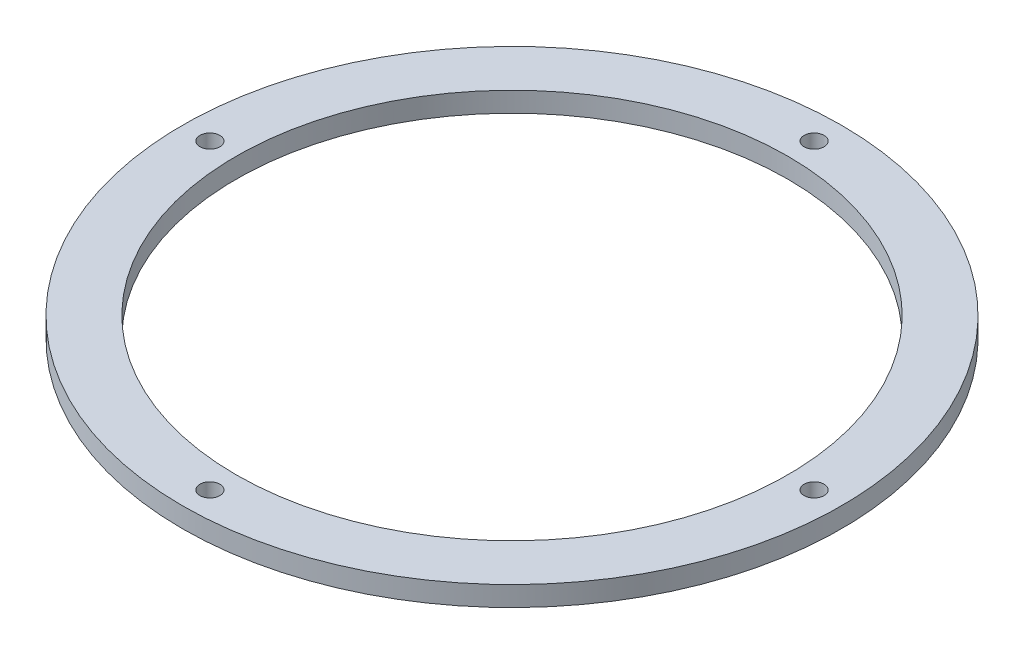
ISO-10303-21;
HEADER;
FILE_DESCRIPTION(('STEP AP214'),'2;1');
FILE_NAME('part.step','',(''),(''),'','','');
FILE_SCHEMA(('AUTOMOTIVE_DESIGN { 1 0 10303 214 1 1 1 1 }'));
ENDSEC;
DATA;
#1=APPLICATION_CONTEXT('core data for automotive mechanical design processes');
#2=APPLICATION_PROTOCOL_DEFINITION('international standard','automotive_design',2000,#1);
#3=PRODUCT_CONTEXT('',#1,'mechanical');
#4=PRODUCT('Part','Part','',(#3));
#5=PRODUCT_RELATED_PRODUCT_CATEGORY('part','',(#4));
#6=PRODUCT_DEFINITION_FORMATION('','',#4);
#7=PRODUCT_DEFINITION_CONTEXT('part definition',#1,'design');
#8=PRODUCT_DEFINITION('design','',#6,#7);
#9=PRODUCT_DEFINITION_SHAPE('','',#8);
#10=(LENGTH_UNIT() NAMED_UNIT(*) SI_UNIT(.MILLI.,.METRE.));
#11=(NAMED_UNIT(*) PLANE_ANGLE_UNIT() SI_UNIT($,.RADIAN.));
#12=(NAMED_UNIT(*) SI_UNIT($,.STERADIAN.) SOLID_ANGLE_UNIT());
#13=UNCERTAINTY_MEASURE_WITH_UNIT(LENGTH_MEASURE(1.E-05),#10,'distance_accuracy_value','');
#14=(GEOMETRIC_REPRESENTATION_CONTEXT(3) GLOBAL_UNCERTAINTY_ASSIGNED_CONTEXT((#13)) GLOBAL_UNIT_ASSIGNED_CONTEXT((#10,
#11,#12)) REPRESENTATION_CONTEXT('',''));
#15=CARTESIAN_POINT('',(0.,0.,0.));
#16=DIRECTION('',(0.,0.,1.));
#17=DIRECTION('',(1.,0.,0.));
#18=AXIS2_PLACEMENT_3D('',#15,#16,#17);
#19=CARTESIAN_POINT('',(0.,5.2,0.));
#20=DIRECTION('',(0.,1.,0.));
#21=DIRECTION('',(0.,0.,1.));
#22=AXIS2_PLACEMENT_3D('',#19,#20,#21);
#23=PLANE('',#22);
#24=CARTESIAN_POINT('',(0.,5.2,78.83));
#25=DIRECTION('',(0.,1.,0.));
#26=DIRECTION('',(0.,0.,1.));
#27=AXIS2_PLACEMENT_3D('',#24,#25,#26);
#28=CIRCLE('',#27,2.60000000000001);
#29=CARTESIAN_POINT('',(0.,5.2,81.43));
#30=VERTEX_POINT('',#29);
#31=EDGE_CURVE('E67',#30,#30,#28,.T.);
#32=ORIENTED_EDGE('',*,*,#31,.F.);
#33=EDGE_LOOP('',(#32));
#34=FACE_BOUND('',#33,.T.);
#35=CARTESIAN_POINT('',(0.,5.2,-78.83));
#36=DIRECTION('',(0.,1.,0.));
#37=DIRECTION('',(0.,0.,1.));
#38=AXIS2_PLACEMENT_3D('',#35,#36,#37);
#39=CIRCLE('',#38,2.60000000000001);
#40=CARTESIAN_POINT('',(0.,5.2,-76.23));
#41=VERTEX_POINT('',#40);
#42=EDGE_CURVE('E55',#41,#41,#39,.T.);
#43=ORIENTED_EDGE('',*,*,#42,.F.);
#44=EDGE_LOOP('',(#43));
#45=FACE_BOUND('',#44,.T.);
#46=CARTESIAN_POINT('',(0.,5.2,0.));
#47=DIRECTION('',(0.,1.,0.));
#48=DIRECTION('',(0.,0.,1.));
#49=AXIS2_PLACEMENT_3D('',#46,#47,#48);
#50=CIRCLE('',#49,86.);
#51=CARTESIAN_POINT('',(0.,5.2,86.));
#52=VERTEX_POINT('',#51);
#53=EDGE_CURVE('E10',#52,#52,#50,.T.);
#54=ORIENTED_EDGE('',*,*,#53,.T.);
#55=EDGE_LOOP('',(#54));
#56=FACE_BOUND('',#55,.T.);
#57=CARTESIAN_POINT('',(0.,5.2,0.));
#58=DIRECTION('',(0.,1.,0.));
#59=DIRECTION('',(0.,0.,1.));
#60=AXIS2_PLACEMENT_3D('',#57,#58,#59);
#61=CIRCLE('',#60,72.);
#62=CARTESIAN_POINT('',(0.,5.2,72.));
#63=VERTEX_POINT('',#62);
#64=EDGE_CURVE('E50',#63,#63,#61,.T.);
#65=ORIENTED_EDGE('',*,*,#64,.F.);
#66=EDGE_LOOP('',(#65));
#67=FACE_BOUND('',#66,.T.);
#68=CARTESIAN_POINT('',(78.83,5.2,0.));
#69=DIRECTION('',(0.,1.,0.));
#70=DIRECTION('',(0.,0.,1.));
#71=AXIS2_PLACEMENT_3D('',#68,#69,#70);
#72=CIRCLE('',#71,2.6);
#73=CARTESIAN_POINT('',(78.83,5.2,2.6));
#74=VERTEX_POINT('',#73);
#75=EDGE_CURVE('E61',#74,#74,#72,.T.);
#76=ORIENTED_EDGE('',*,*,#75,.F.);
#77=EDGE_LOOP('',(#76));
#78=FACE_BOUND('',#77,.T.);
#79=CARTESIAN_POINT('',(-78.83,5.2,0.));
#80=DIRECTION('',(0.,1.,0.));
#81=DIRECTION('',(0.,0.,1.));
#82=AXIS2_PLACEMENT_3D('',#79,#80,#81);
#83=CIRCLE('',#82,2.6);
#84=CARTESIAN_POINT('',(-78.83,5.2,2.6));
#85=VERTEX_POINT('',#84);
#86=EDGE_CURVE('E73',#85,#85,#83,.T.);
#87=ORIENTED_EDGE('',*,*,#86,.F.);
#88=EDGE_LOOP('',(#87));
#89=FACE_BOUND('',#88,.T.);
#90=ADVANCED_FACE('F39',(#34,#45,#56,#67,#78,#89),#23,.T.);
#91=CARTESIAN_POINT('',(0.,0.,0.));
#92=DIRECTION('',(0.,1.,0.));
#93=DIRECTION('',(0.,0.,1.));
#94=AXIS2_PLACEMENT_3D('',#91,#92,#93);
#95=PLANE('',#94);
#96=CARTESIAN_POINT('',(0.,0.,0.));
#97=DIRECTION('',(0.,1.,0.));
#98=DIRECTION('',(0.,0.,1.));
#99=AXIS2_PLACEMENT_3D('',#96,#97,#98);
#100=CIRCLE('',#99,86.);
#101=CARTESIAN_POINT('',(0.,0.,86.));
#102=VERTEX_POINT('',#101);
#103=EDGE_CURVE('E43',#102,#102,#100,.T.);
#104=ORIENTED_EDGE('',*,*,#103,.F.);
#105=EDGE_LOOP('',(#104));
#106=FACE_BOUND('',#105,.T.);
#107=CARTESIAN_POINT('',(0.,0.,0.));
#108=DIRECTION('',(0.,1.,0.));
#109=DIRECTION('',(0.,0.,1.));
#110=AXIS2_PLACEMENT_3D('',#107,#108,#109);
#111=CIRCLE('',#110,72.);
#112=CARTESIAN_POINT('',(0.,0.,72.));
#113=VERTEX_POINT('',#112);
#114=EDGE_CURVE('E52',#113,#113,#111,.T.);
#115=ORIENTED_EDGE('',*,*,#114,.T.);
#116=EDGE_LOOP('',(#115));
#117=FACE_BOUND('',#116,.T.);
#118=CARTESIAN_POINT('',(0.,0.,-78.83));
#119=DIRECTION('',(0.,1.,0.));
#120=DIRECTION('',(0.,0.,1.));
#121=AXIS2_PLACEMENT_3D('',#118,#119,#120);
#122=CIRCLE('',#121,2.60000000000001);
#123=CARTESIAN_POINT('',(0.,0.,-76.23));
#124=VERTEX_POINT('',#123);
#125=EDGE_CURVE('E58',#124,#124,#122,.T.);
#126=ORIENTED_EDGE('',*,*,#125,.T.);
#127=EDGE_LOOP('',(#126));
#128=FACE_BOUND('',#127,.T.);
#129=CARTESIAN_POINT('',(78.83,0.,0.));
#130=DIRECTION('',(0.,1.,0.));
#131=DIRECTION('',(0.,0.,1.));
#132=AXIS2_PLACEMENT_3D('',#129,#130,#131);
#133=CIRCLE('',#132,2.6);
#134=CARTESIAN_POINT('',(78.83,0.,2.6));
#135=VERTEX_POINT('',#134);
#136=EDGE_CURVE('E64',#135,#135,#133,.T.);
#137=ORIENTED_EDGE('',*,*,#136,.T.);
#138=EDGE_LOOP('',(#137));
#139=FACE_BOUND('',#138,.T.);
#140=CARTESIAN_POINT('',(0.,0.,78.83));
#141=DIRECTION('',(0.,1.,0.));
#142=DIRECTION('',(0.,0.,1.));
#143=AXIS2_PLACEMENT_3D('',#140,#141,#142);
#144=CIRCLE('',#143,2.60000000000001);
#145=CARTESIAN_POINT('',(0.,0.,81.43));
#146=VERTEX_POINT('',#145);
#147=EDGE_CURVE('E70',#146,#146,#144,.T.);
#148=ORIENTED_EDGE('',*,*,#147,.T.);
#149=EDGE_LOOP('',(#148));
#150=FACE_BOUND('',#149,.T.);
#151=CARTESIAN_POINT('',(-78.83,0.,0.));
#152=DIRECTION('',(0.,1.,0.));
#153=DIRECTION('',(0.,0.,1.));
#154=AXIS2_PLACEMENT_3D('',#151,#152,#153);
#155=CIRCLE('',#154,2.6);
#156=CARTESIAN_POINT('',(-78.83,0.,2.6));
#157=VERTEX_POINT('',#156);
#158=EDGE_CURVE('E76',#157,#157,#155,.T.);
#159=ORIENTED_EDGE('',*,*,#158,.T.);
#160=EDGE_LOOP('',(#159));
#161=FACE_BOUND('',#160,.T.);
#162=ADVANCED_FACE('F86',(#106,#117,#128,#139,#150,#161),#95,.F.);
#163=CARTESIAN_POINT('',(0.,5.2,0.));
#164=DIRECTION('',(0.,-1.,0.));
#165=DIRECTION('',(0.,0.,-1.));
#166=AXIS2_PLACEMENT_3D('',#163,#164,#165);
#167=CYLINDRICAL_SURFACE('',#166,86.);
#168=ORIENTED_EDGE('',*,*,#53,.F.);
#169=EDGE_LOOP('',(#168));
#170=FACE_BOUND('',#169,.T.);
#171=ORIENTED_EDGE('',*,*,#103,.T.);
#172=EDGE_LOOP('',(#171));
#173=FACE_BOUND('',#172,.T.);
#174=ADVANCED_FACE('F41',(#170,#173),#167,.T.);
#175=CARTESIAN_POINT('',(0.,5.2,0.));
#176=DIRECTION('',(0.,-1.,0.));
#177=DIRECTION('',(0.,0.,-1.));
#178=AXIS2_PLACEMENT_3D('',#175,#176,#177);
#179=CYLINDRICAL_SURFACE('',#178,72.);
#180=ORIENTED_EDGE('',*,*,#64,.T.);
#181=EDGE_LOOP('',(#180));
#182=FACE_BOUND('',#181,.T.);
#183=ORIENTED_EDGE('',*,*,#114,.F.);
#184=EDGE_LOOP('',(#183));
#185=FACE_BOUND('',#184,.T.);
#186=ADVANCED_FACE('F96',(#182,#185),#179,.F.);
#187=CARTESIAN_POINT('',(0.,5.2,-78.83));
#188=DIRECTION('',(0.,-1.,0.));
#189=DIRECTION('',(0.,0.,-1.));
#190=AXIS2_PLACEMENT_3D('',#187,#188,#189);
#191=CYLINDRICAL_SURFACE('',#190,2.60000000000001);
#192=ORIENTED_EDGE('',*,*,#42,.T.);
#193=EDGE_LOOP('',(#192));
#194=FACE_BOUND('',#193,.T.);
#195=ORIENTED_EDGE('',*,*,#125,.F.);
#196=EDGE_LOOP('',(#195));
#197=FACE_BOUND('',#196,.T.);
#198=ADVANCED_FACE('F99',(#194,#197),#191,.F.);
#199=CARTESIAN_POINT('',(78.83,5.2,0.));
#200=DIRECTION('',(0.,-1.,0.));
#201=DIRECTION('',(0.,0.,-1.));
#202=AXIS2_PLACEMENT_3D('',#199,#200,#201);
#203=CYLINDRICAL_SURFACE('',#202,2.6);
#204=ORIENTED_EDGE('',*,*,#75,.T.);
#205=EDGE_LOOP('',(#204));
#206=FACE_BOUND('',#205,.T.);
#207=ORIENTED_EDGE('',*,*,#136,.F.);
#208=EDGE_LOOP('',(#207));
#209=FACE_BOUND('',#208,.T.);
#210=ADVANCED_FACE('F103',(#206,#209),#203,.F.);
#211=CARTESIAN_POINT('',(0.,5.2,78.83));
#212=DIRECTION('',(0.,-1.,0.));
#213=DIRECTION('',(0.,0.,-1.));
#214=AXIS2_PLACEMENT_3D('',#211,#212,#213);
#215=CYLINDRICAL_SURFACE('',#214,2.60000000000001);
#216=ORIENTED_EDGE('',*,*,#31,.T.);
#217=EDGE_LOOP('',(#216));
#218=FACE_BOUND('',#217,.T.);
#219=ORIENTED_EDGE('',*,*,#147,.F.);
#220=EDGE_LOOP('',(#219));
#221=FACE_BOUND('',#220,.T.);
#222=ADVANCED_FACE('F107',(#218,#221),#215,.F.);
#223=CARTESIAN_POINT('',(-78.83,5.2,0.));
#224=DIRECTION('',(0.,-1.,0.));
#225=DIRECTION('',(0.,0.,-1.));
#226=AXIS2_PLACEMENT_3D('',#223,#224,#225);
#227=CYLINDRICAL_SURFACE('',#226,2.6);
#228=ORIENTED_EDGE('',*,*,#86,.T.);
#229=EDGE_LOOP('',(#228));
#230=FACE_BOUND('',#229,.T.);
#231=ORIENTED_EDGE('',*,*,#158,.F.);
#232=EDGE_LOOP('',(#231));
#233=FACE_BOUND('',#232,.T.);
#234=ADVANCED_FACE('F82',(#230,#233),#227,.F.);
#235=CLOSED_SHELL('',(#90,#162,#174,#186,#198,#210,#222,#234));
#236=MANIFOLD_SOLID_BREP('B2',#235);
#237=ADVANCED_BREP_SHAPE_REPRESENTATION('',(#18,#236),#14);
#238=SHAPE_DEFINITION_REPRESENTATION(#9,#237);
ENDSEC;
END-ISO-10303-21;
